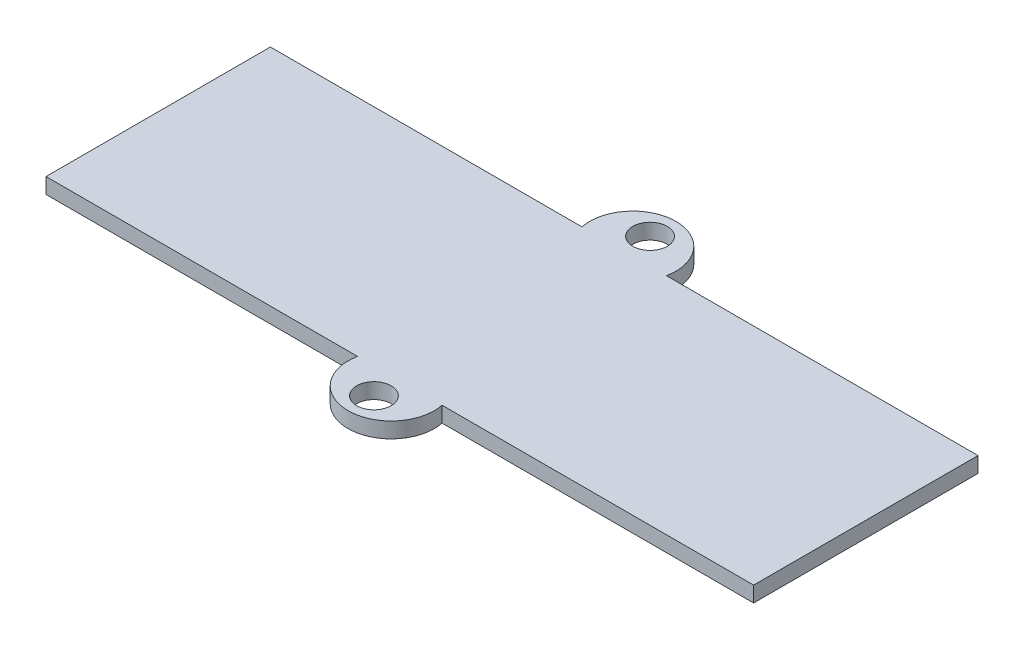
ISO-10303-21;
HEADER;
FILE_DESCRIPTION(('STEP AP214'),'2;1');
FILE_NAME('part.step','',(''),(''),'','','');
FILE_SCHEMA(('AUTOMOTIVE_DESIGN { 1 0 10303 214 1 1 1 1 }'));
ENDSEC;
DATA;
#1=APPLICATION_CONTEXT('core data for automotive mechanical design processes');
#2=APPLICATION_PROTOCOL_DEFINITION('international standard','automotive_design',2000,#1);
#3=PRODUCT_CONTEXT('',#1,'mechanical');
#4=PRODUCT('Part','Part','',(#3));
#5=PRODUCT_RELATED_PRODUCT_CATEGORY('part','',(#4));
#6=PRODUCT_DEFINITION_FORMATION('','',#4);
#7=PRODUCT_DEFINITION_CONTEXT('part definition',#1,'design');
#8=PRODUCT_DEFINITION('design','',#6,#7);
#9=PRODUCT_DEFINITION_SHAPE('','',#8);
#10=(LENGTH_UNIT() NAMED_UNIT(*) SI_UNIT(.MILLI.,.METRE.));
#11=(NAMED_UNIT(*) PLANE_ANGLE_UNIT() SI_UNIT($,.RADIAN.));
#12=(NAMED_UNIT(*) SI_UNIT($,.STERADIAN.) SOLID_ANGLE_UNIT());
#13=UNCERTAINTY_MEASURE_WITH_UNIT(LENGTH_MEASURE(1.E-05),#10,'distance_accuracy_value','');
#14=(GEOMETRIC_REPRESENTATION_CONTEXT(3) GLOBAL_UNCERTAINTY_ASSIGNED_CONTEXT((#13)) GLOBAL_UNIT_ASSIGNED_CONTEXT((#10,
#11,#12)) REPRESENTATION_CONTEXT('',''));
#15=CARTESIAN_POINT('',(0.,0.,0.));
#16=DIRECTION('',(0.,0.,1.));
#17=DIRECTION('',(1.,0.,0.));
#18=AXIS2_PLACEMENT_3D('',#15,#16,#17);
#19=CARTESIAN_POINT('',(123.08278305538,1.8,-3.00969407562476));
#20=DIRECTION('',(0.,1.,0.));
#21=DIRECTION('',(0.,0.,1.));
#22=AXIS2_PLACEMENT_3D('',#19,#20,#21);
#23=PLANE('',#22);
#24=CARTESIAN_POINT('',(123.08278305538,1.8,-5.00969407562476));
#25=DIRECTION('',(0.,1.,0.));
#26=DIRECTION('',(0.,0.,1.));
#27=AXIS2_PLACEMENT_3D('',#24,#25,#26);
#28=CIRCLE('',#27,2.);
#29=CARTESIAN_POINT('',(123.08278305538,1.8,-3.00969407562477));
#30=VERTEX_POINT('',#29);
#31=EDGE_CURVE('E136',#30,#30,#28,.T.);
#32=ORIENTED_EDGE('',*,*,#31,.F.);
#33=EDGE_LOOP('',(#32));
#34=FACE_BOUND('',#33,.T.);
#35=CARTESIAN_POINT('',(123.08278305538,1.8,-3.00969407562476));
#36=DIRECTION('',(0.,1.,0.));
#37=DIRECTION('',(0.,0.,1.));
#38=AXIS2_PLACEMENT_3D('',#35,#36,#37);
#39=CIRCLE('',#38,5.);
#40=CARTESIAN_POINT('',(127.981762540946,1.8,-2.00969407562476));
#41=VERTEX_POINT('',#40);
#42=CARTESIAN_POINT('',(118.183803569814,1.8,-2.00969407562476));
#43=VERTEX_POINT('',#42);
#44=EDGE_CURVE('E147',#41,#43,#39,.T.);
#45=ORIENTED_EDGE('',*,*,#44,.T.);
#46=DIRECTION('',(-1.,0.,0.));
#47=VECTOR('',#46,1.);
#48=CARTESIAN_POINT('',(118.183803569814,1.8,-2.00969407562476));
#49=LINE('',#48,#47);
#50=CARTESIAN_POINT('',(82.0827830553799,1.8,-2.00969407562476));
#51=VERTEX_POINT('',#50);
#52=EDGE_CURVE('E95',#43,#51,#49,.T.);
#53=ORIENTED_EDGE('',*,*,#52,.T.);
#54=DIRECTION('',(0.,0.,1.));
#55=VECTOR('',#54,1.);
#56=CARTESIAN_POINT('',(82.0827830553799,1.8,-2.00969407562476));
#57=LINE('',#56,#55);
#58=CARTESIAN_POINT('',(82.0827830553799,1.8,23.9903059243752));
#59=VERTEX_POINT('',#58);
#60=EDGE_CURVE('E162',#51,#59,#57,.T.);
#61=ORIENTED_EDGE('',*,*,#60,.T.);
#62=DIRECTION('',(1.,0.,0.));
#63=VECTOR('',#62,1.);
#64=CARTESIAN_POINT('',(82.0827830553799,1.8,23.9903059243752));
#65=LINE('',#64,#63);
#66=CARTESIAN_POINT('',(118.183803569814,1.8,23.9903059243752));
#67=VERTEX_POINT('',#66);
#68=EDGE_CURVE('E175',#59,#67,#65,.T.);
#69=ORIENTED_EDGE('',*,*,#68,.T.);
#70=CARTESIAN_POINT('',(123.08278305538,1.8,24.9903059243752));
#71=DIRECTION('',(0.,1.,0.));
#72=DIRECTION('',(0.,0.,1.));
#73=AXIS2_PLACEMENT_3D('',#70,#71,#72);
#74=CIRCLE('',#73,5.00000000000001);
#75=CARTESIAN_POINT('',(127.981762540946,1.8,23.9903059243752));
#76=VERTEX_POINT('',#75);
#77=EDGE_CURVE('E114',#67,#76,#74,.T.);
#78=ORIENTED_EDGE('',*,*,#77,.T.);
#79=DIRECTION('',(1.,0.,0.));
#80=VECTOR('',#79,1.);
#81=CARTESIAN_POINT('',(127.981762540946,1.8,23.9903059243752));
#82=LINE('',#81,#80);
#83=CARTESIAN_POINT('',(164.08278305538,1.8,23.9903059243752));
#84=VERTEX_POINT('',#83);
#85=EDGE_CURVE('E108',#76,#84,#82,.T.);
#86=ORIENTED_EDGE('',*,*,#85,.T.);
#87=DIRECTION('',(0.,0.,-1.));
#88=VECTOR('',#87,1.);
#89=CARTESIAN_POINT('',(164.08278305538,1.8,23.9903059243752));
#90=LINE('',#89,#88);
#91=CARTESIAN_POINT('',(164.08278305538,1.8,-2.00969407562476));
#92=VERTEX_POINT('',#91);
#93=EDGE_CURVE('E112',#84,#92,#90,.T.);
#94=ORIENTED_EDGE('',*,*,#93,.T.);
#95=DIRECTION('',(-1.,0.,0.));
#96=VECTOR('',#95,1.);
#97=CARTESIAN_POINT('',(164.08278305538,1.8,-2.00969407562476));
#98=LINE('',#97,#96);
#99=EDGE_CURVE('E52',#92,#41,#98,.T.);
#100=ORIENTED_EDGE('',*,*,#99,.T.);
#101=EDGE_LOOP('',(#45,#53,#61,#69,#78,#86,#94,#100));
#102=FACE_BOUND('',#101,.T.);
#103=CARTESIAN_POINT('',(123.08278305538,1.8,26.9903059243752));
#104=DIRECTION('',(0.,1.,0.));
#105=DIRECTION('',(0.,0.,1.));
#106=AXIS2_PLACEMENT_3D('',#103,#104,#105);
#107=CIRCLE('',#106,2.);
#108=CARTESIAN_POINT('',(123.08278305538,1.8,28.9903059243752));
#109=VERTEX_POINT('',#108);
#110=EDGE_CURVE('E184',#109,#109,#107,.T.);
#111=ORIENTED_EDGE('',*,*,#110,.F.);
#112=EDGE_LOOP('',(#111));
#113=FACE_BOUND('',#112,.T.);
#114=ADVANCED_FACE('F35',(#34,#102,#113),#23,.T.);
#115=CARTESIAN_POINT('',(123.08278305538,0.,-3.00969407562476));
#116=DIRECTION('',(0.,1.,0.));
#117=DIRECTION('',(0.,0.,1.));
#118=AXIS2_PLACEMENT_3D('',#115,#116,#117);
#119=PLANE('',#118);
#120=CARTESIAN_POINT('',(123.08278305538,0.,-3.00969407562476));
#121=DIRECTION('',(0.,1.,0.));
#122=DIRECTION('',(0.,0.,1.));
#123=AXIS2_PLACEMENT_3D('',#120,#121,#122);
#124=CIRCLE('',#123,5.);
#125=CARTESIAN_POINT('',(127.981762540946,0.,-2.00969407562476));
#126=VERTEX_POINT('',#125);
#127=CARTESIAN_POINT('',(118.183803569814,0.,-2.00969407562476));
#128=VERTEX_POINT('',#127);
#129=EDGE_CURVE('E132',#126,#128,#124,.T.);
#130=ORIENTED_EDGE('',*,*,#129,.F.);
#131=DIRECTION('',(-1.,0.,0.));
#132=VECTOR('',#131,1.);
#133=CARTESIAN_POINT('',(164.08278305538,0.,-2.00969407562476));
#134=LINE('',#133,#132);
#135=CARTESIAN_POINT('',(164.08278305538,0.,-2.00969407562476));
#136=VERTEX_POINT('',#135);
#137=EDGE_CURVE('E87',#136,#126,#134,.T.);
#138=ORIENTED_EDGE('',*,*,#137,.F.);
#139=DIRECTION('',(0.,0.,-1.));
#140=VECTOR('',#139,1.);
#141=CARTESIAN_POINT('',(164.08278305538,0.,23.9903059243752));
#142=LINE('',#141,#140);
#143=CARTESIAN_POINT('',(164.08278305538,0.,23.9903059243752));
#144=VERTEX_POINT('',#143);
#145=EDGE_CURVE('E81',#144,#136,#142,.T.);
#146=ORIENTED_EDGE('',*,*,#145,.F.);
#147=DIRECTION('',(1.,0.,0.));
#148=VECTOR('',#147,1.);
#149=CARTESIAN_POINT('',(127.981762540946,0.,23.9903059243752));
#150=LINE('',#149,#148);
#151=CARTESIAN_POINT('',(127.981762540946,0.,23.9903059243752));
#152=VERTEX_POINT('',#151);
#153=EDGE_CURVE('E122',#152,#144,#150,.T.);
#154=ORIENTED_EDGE('',*,*,#153,.F.);
#155=CARTESIAN_POINT('',(123.08278305538,0.,24.9903059243752));
#156=DIRECTION('',(0.,1.,0.));
#157=DIRECTION('',(0.,0.,1.));
#158=AXIS2_PLACEMENT_3D('',#155,#156,#157);
#159=CIRCLE('',#158,5.00000000000001);
#160=CARTESIAN_POINT('',(118.183803569814,0.,23.9903059243752));
#161=VERTEX_POINT('',#160);
#162=EDGE_CURVE('E142',#161,#152,#159,.T.);
#163=ORIENTED_EDGE('',*,*,#162,.F.);
#164=DIRECTION('',(1.,0.,0.));
#165=VECTOR('',#164,1.);
#166=CARTESIAN_POINT('',(82.0827830553799,0.,23.9903059243752));
#167=LINE('',#166,#165);
#168=CARTESIAN_POINT('',(82.0827830553799,0.,23.9903059243752));
#169=VERTEX_POINT('',#168);
#170=EDGE_CURVE('E140',#169,#161,#167,.T.);
#171=ORIENTED_EDGE('',*,*,#170,.F.);
#172=DIRECTION('',(0.,0.,1.));
#173=VECTOR('',#172,1.);
#174=CARTESIAN_POINT('',(82.0827830553799,0.,-2.00969407562476));
#175=LINE('',#174,#173);
#176=CARTESIAN_POINT('',(82.0827830553799,0.,-2.00969407562476));
#177=VERTEX_POINT('',#176);
#178=EDGE_CURVE('E138',#177,#169,#175,.T.);
#179=ORIENTED_EDGE('',*,*,#178,.F.);
#180=DIRECTION('',(-1.,0.,0.));
#181=VECTOR('',#180,1.);
#182=CARTESIAN_POINT('',(118.183803569814,0.,-2.00969407562476));
#183=LINE('',#182,#181);
#184=EDGE_CURVE('E135',#128,#177,#183,.T.);
#185=ORIENTED_EDGE('',*,*,#184,.F.);
#186=EDGE_LOOP('',(#130,#138,#146,#154,#163,#171,#179,#185));
#187=FACE_BOUND('',#186,.T.);
#188=CARTESIAN_POINT('',(123.08278305538,0.,-5.00969407562476));
#189=DIRECTION('',(0.,1.,0.));
#190=DIRECTION('',(0.,0.,1.));
#191=AXIS2_PLACEMENT_3D('',#188,#189,#190);
#192=CIRCLE('',#191,2.);
#193=CARTESIAN_POINT('',(123.08278305538,0.,-3.00969407562477));
#194=VERTEX_POINT('',#193);
#195=EDGE_CURVE('E181',#194,#194,#192,.T.);
#196=ORIENTED_EDGE('',*,*,#195,.T.);
#197=EDGE_LOOP('',(#196));
#198=FACE_BOUND('',#197,.T.);
#199=CARTESIAN_POINT('',(123.08278305538,0.,26.9903059243752));
#200=DIRECTION('',(0.,1.,0.));
#201=DIRECTION('',(0.,0.,1.));
#202=AXIS2_PLACEMENT_3D('',#199,#200,#201);
#203=CIRCLE('',#202,2.);
#204=CARTESIAN_POINT('',(123.08278305538,0.,28.9903059243752));
#205=VERTEX_POINT('',#204);
#206=EDGE_CURVE('E187',#205,#205,#203,.T.);
#207=ORIENTED_EDGE('',*,*,#206,.T.);
#208=EDGE_LOOP('',(#207));
#209=FACE_BOUND('',#208,.T.);
#210=ADVANCED_FACE('F166',(#187,#198,#209),#119,.F.);
#211=CARTESIAN_POINT('',(123.08278305538,1.8,-3.00969407562476));
#212=DIRECTION('',(0.,-1.,0.));
#213=DIRECTION('',(0.,0.,-1.));
#214=AXIS2_PLACEMENT_3D('',#211,#212,#213);
#215=CYLINDRICAL_SURFACE('',#214,5.);
#216=ORIENTED_EDGE('',*,*,#129,.T.);
#217=DIRECTION('',(0.,-1.,0.));
#218=VECTOR('',#217,1.);
#219=CARTESIAN_POINT('',(118.183803569814,1.8,-2.00969407562476));
#220=LINE('',#219,#218);
#221=EDGE_CURVE('E11',#43,#128,#220,.T.);
#222=ORIENTED_EDGE('',*,*,#221,.F.);
#223=ORIENTED_EDGE('',*,*,#44,.F.);
#224=DIRECTION('',(0.,-1.,0.));
#225=VECTOR('',#224,1.);
#226=CARTESIAN_POINT('',(127.981762540946,1.8,-2.00969407562476));
#227=LINE('',#226,#225);
#228=EDGE_CURVE('E128',#41,#126,#227,.T.);
#229=ORIENTED_EDGE('',*,*,#228,.T.);
#230=EDGE_LOOP('',(#216,#222,#223,#229));
#231=FACE_BOUND('',#230,.T.);
#232=ADVANCED_FACE('F37',(#231),#215,.T.);
#233=CARTESIAN_POINT('',(118.183803569814,1.8,-2.00969407562476));
#234=DIRECTION('',(0.,0.,1.));
#235=DIRECTION('',(1.,0.,0.));
#236=AXIS2_PLACEMENT_3D('',#233,#234,#235);
#237=PLANE('',#236);
#238=ORIENTED_EDGE('',*,*,#184,.T.);
#239=DIRECTION('',(0.,-1.,0.));
#240=VECTOR('',#239,1.);
#241=CARTESIAN_POINT('',(82.0827830553799,1.8,-2.00969407562476));
#242=LINE('',#241,#240);
#243=EDGE_CURVE('E44',#51,#177,#242,.T.);
#244=ORIENTED_EDGE('',*,*,#243,.F.);
#245=ORIENTED_EDGE('',*,*,#52,.F.);
#246=ORIENTED_EDGE('',*,*,#221,.T.);
#247=EDGE_LOOP('',(#238,#244,#245,#246));
#248=FACE_BOUND('',#247,.T.);
#249=ADVANCED_FACE('F219',(#248),#237,.F.);
#250=CARTESIAN_POINT('',(82.0827830553799,1.8,-2.00969407562476));
#251=DIRECTION('',(1.,0.,0.));
#252=DIRECTION('',(0.,0.,-1.));
#253=AXIS2_PLACEMENT_3D('',#250,#251,#252);
#254=PLANE('',#253);
#255=ORIENTED_EDGE('',*,*,#178,.T.);
#256=DIRECTION('',(0.,-1.,0.));
#257=VECTOR('',#256,1.);
#258=CARTESIAN_POINT('',(82.0827830553799,1.8,23.9903059243752));
#259=LINE('',#258,#257);
#260=EDGE_CURVE('E154',#59,#169,#259,.T.);
#261=ORIENTED_EDGE('',*,*,#260,.F.);
#262=ORIENTED_EDGE('',*,*,#60,.F.);
#263=ORIENTED_EDGE('',*,*,#243,.T.);
#264=EDGE_LOOP('',(#255,#261,#262,#263));
#265=FACE_BOUND('',#264,.T.);
#266=ADVANCED_FACE('F160',(#265),#254,.F.);
#267=CARTESIAN_POINT('',(82.0827830553799,1.8,23.9903059243752));
#268=DIRECTION('',(0.,0.,-1.));
#269=DIRECTION('',(-1.,0.,0.));
#270=AXIS2_PLACEMENT_3D('',#267,#268,#269);
#271=PLANE('',#270);
#272=ORIENTED_EDGE('',*,*,#170,.T.);
#273=DIRECTION('',(0.,-1.,0.));
#274=VECTOR('',#273,1.);
#275=CARTESIAN_POINT('',(118.183803569814,1.8,23.9903059243752));
#276=LINE('',#275,#274);
#277=EDGE_CURVE('E151',#67,#161,#276,.T.);
#278=ORIENTED_EDGE('',*,*,#277,.F.);
#279=ORIENTED_EDGE('',*,*,#68,.F.);
#280=ORIENTED_EDGE('',*,*,#260,.T.);
#281=EDGE_LOOP('',(#272,#278,#279,#280));
#282=FACE_BOUND('',#281,.T.);
#283=ADVANCED_FACE('F171',(#282),#271,.F.);
#284=CARTESIAN_POINT('',(123.08278305538,1.8,24.9903059243752));
#285=DIRECTION('',(0.,-1.,0.));
#286=DIRECTION('',(0.,0.,-1.));
#287=AXIS2_PLACEMENT_3D('',#284,#285,#286);
#288=CYLINDRICAL_SURFACE('',#287,5.00000000000001);
#289=ORIENTED_EDGE('',*,*,#162,.T.);
#290=DIRECTION('',(0.,-1.,0.));
#291=VECTOR('',#290,1.);
#292=CARTESIAN_POINT('',(127.981762540946,1.8,23.9903059243752));
#293=LINE('',#292,#291);
#294=EDGE_CURVE('E123',#76,#152,#293,.T.);
#295=ORIENTED_EDGE('',*,*,#294,.F.);
#296=ORIENTED_EDGE('',*,*,#77,.F.);
#297=ORIENTED_EDGE('',*,*,#277,.T.);
#298=EDGE_LOOP('',(#289,#295,#296,#297));
#299=FACE_BOUND('',#298,.T.);
#300=ADVANCED_FACE('F174',(#299),#288,.T.);
#301=CARTESIAN_POINT('',(127.981762540946,1.8,23.9903059243752));
#302=DIRECTION('',(0.,0.,-1.));
#303=DIRECTION('',(-1.,0.,0.));
#304=AXIS2_PLACEMENT_3D('',#301,#302,#303);
#305=PLANE('',#304);
#306=ORIENTED_EDGE('',*,*,#153,.T.);
#307=DIRECTION('',(0.,-1.,0.));
#308=VECTOR('',#307,1.);
#309=CARTESIAN_POINT('',(164.08278305538,1.8,23.9903059243752));
#310=LINE('',#309,#308);
#311=EDGE_CURVE('E119',#84,#144,#310,.T.);
#312=ORIENTED_EDGE('',*,*,#311,.F.);
#313=ORIENTED_EDGE('',*,*,#85,.F.);
#314=ORIENTED_EDGE('',*,*,#294,.T.);
#315=EDGE_LOOP('',(#306,#312,#313,#314));
#316=FACE_BOUND('',#315,.T.);
#317=ADVANCED_FACE('F120',(#316),#305,.F.);
#318=CARTESIAN_POINT('',(164.08278305538,1.8,23.9903059243752));
#319=DIRECTION('',(-1.,0.,0.));
#320=DIRECTION('',(0.,0.,1.));
#321=AXIS2_PLACEMENT_3D('',#318,#319,#320);
#322=PLANE('',#321);
#323=ORIENTED_EDGE('',*,*,#145,.T.);
#324=DIRECTION('',(0.,-1.,0.));
#325=VECTOR('',#324,1.);
#326=CARTESIAN_POINT('',(164.08278305538,1.8,-2.00969407562476));
#327=LINE('',#326,#325);
#328=EDGE_CURVE('E124',#92,#136,#327,.T.);
#329=ORIENTED_EDGE('',*,*,#328,.F.);
#330=ORIENTED_EDGE('',*,*,#93,.F.);
#331=ORIENTED_EDGE('',*,*,#311,.T.);
#332=EDGE_LOOP('',(#323,#329,#330,#331));
#333=FACE_BOUND('',#332,.T.);
#334=ADVANCED_FACE('F126',(#333),#322,.F.);
#335=CARTESIAN_POINT('',(164.08278305538,1.8,-2.00969407562476));
#336=DIRECTION('',(0.,0.,1.));
#337=DIRECTION('',(1.,0.,0.));
#338=AXIS2_PLACEMENT_3D('',#335,#336,#337);
#339=PLANE('',#338);
#340=ORIENTED_EDGE('',*,*,#137,.T.);
#341=ORIENTED_EDGE('',*,*,#228,.F.);
#342=ORIENTED_EDGE('',*,*,#99,.F.);
#343=ORIENTED_EDGE('',*,*,#328,.T.);
#344=EDGE_LOOP('',(#340,#341,#342,#343));
#345=FACE_BOUND('',#344,.T.);
#346=ADVANCED_FACE('F207',(#345),#339,.F.);
#347=CARTESIAN_POINT('',(123.08278305538,1.8,-5.00969407562476));
#348=DIRECTION('',(0.,-1.,0.));
#349=DIRECTION('',(0.,0.,-1.));
#350=AXIS2_PLACEMENT_3D('',#347,#348,#349);
#351=CYLINDRICAL_SURFACE('',#350,2.);
#352=ORIENTED_EDGE('',*,*,#31,.T.);
#353=EDGE_LOOP('',(#352));
#354=FACE_BOUND('',#353,.T.);
#355=ORIENTED_EDGE('',*,*,#195,.F.);
#356=EDGE_LOOP('',(#355));
#357=FACE_BOUND('',#356,.T.);
#358=ADVANCED_FACE('F204',(#354,#357),#351,.F.);
#359=CARTESIAN_POINT('',(123.08278305538,1.8,26.9903059243752));
#360=DIRECTION('',(0.,-1.,0.));
#361=DIRECTION('',(0.,0.,-1.));
#362=AXIS2_PLACEMENT_3D('',#359,#360,#361);
#363=CYLINDRICAL_SURFACE('',#362,2.);
#364=ORIENTED_EDGE('',*,*,#110,.T.);
#365=EDGE_LOOP('',(#364));
#366=FACE_BOUND('',#365,.T.);
#367=ORIENTED_EDGE('',*,*,#206,.F.);
#368=EDGE_LOOP('',(#367));
#369=FACE_BOUND('',#368,.T.);
#370=ADVANCED_FACE('F193',(#366,#369),#363,.F.);
#371=CLOSED_SHELL('',(#114,#210,#232,#249,#266,#283,#300,#317,#334,#346,#358,#370));
#372=MANIFOLD_SOLID_BREP('B2',#371);
#373=ADVANCED_BREP_SHAPE_REPRESENTATION('',(#18,#372),#14);
#374=SHAPE_DEFINITION_REPRESENTATION(#9,#373);
ENDSEC;
END-ISO-10303-21;
